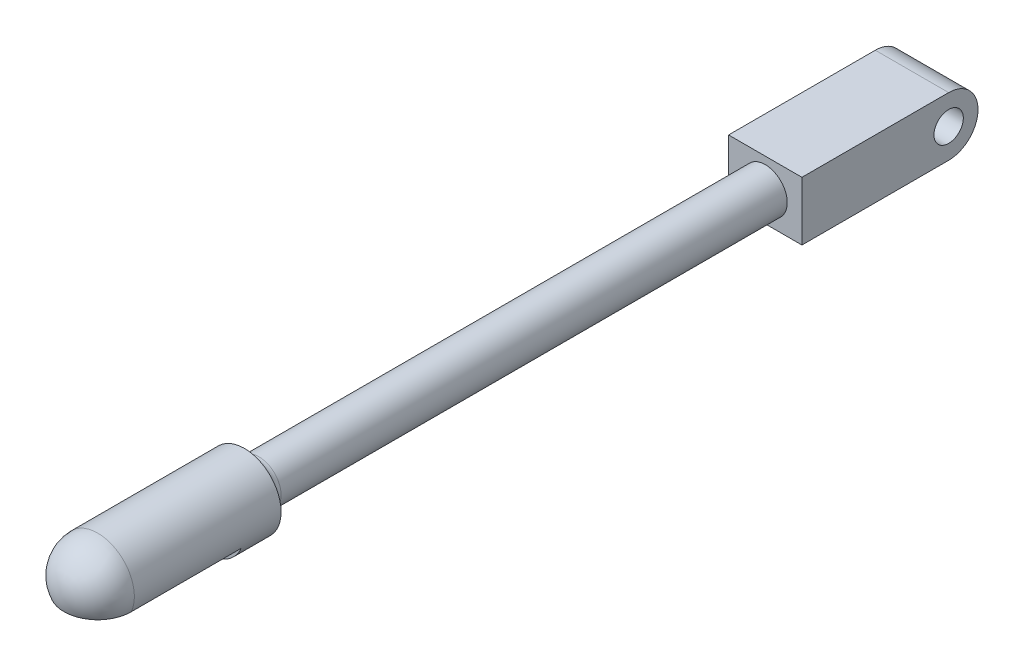
ISO-10303-21;
HEADER;
FILE_DESCRIPTION(('STEP AP214'),'2;1');
FILE_NAME('part.step','',(''),(''),'','','');
FILE_SCHEMA(('AUTOMOTIVE_DESIGN { 1 0 10303 214 1 1 1 1 }'));
ENDSEC;
DATA;
#1=APPLICATION_CONTEXT('core data for automotive mechanical design processes');
#2=APPLICATION_PROTOCOL_DEFINITION('international standard','automotive_design',2000,#1);
#3=PRODUCT_CONTEXT('',#1,'mechanical');
#4=PRODUCT('Part','Part','',(#3));
#5=PRODUCT_RELATED_PRODUCT_CATEGORY('part','',(#4));
#6=PRODUCT_DEFINITION_FORMATION('','',#4);
#7=PRODUCT_DEFINITION_CONTEXT('part definition',#1,'design');
#8=PRODUCT_DEFINITION('design','',#6,#7);
#9=PRODUCT_DEFINITION_SHAPE('','',#8);
#10=(LENGTH_UNIT() NAMED_UNIT(*) SI_UNIT(.MILLI.,.METRE.));
#11=(NAMED_UNIT(*) PLANE_ANGLE_UNIT() SI_UNIT($,.RADIAN.));
#12=(NAMED_UNIT(*) SI_UNIT($,.STERADIAN.) SOLID_ANGLE_UNIT());
#13=UNCERTAINTY_MEASURE_WITH_UNIT(LENGTH_MEASURE(1.E-05),#10,'distance_accuracy_value','');
#14=(GEOMETRIC_REPRESENTATION_CONTEXT(3) GLOBAL_UNCERTAINTY_ASSIGNED_CONTEXT((#13)) GLOBAL_UNIT_ASSIGNED_CONTEXT((#10,
#11,#12)) REPRESENTATION_CONTEXT('',''));
#15=CARTESIAN_POINT('',(0.,0.,0.));
#16=DIRECTION('',(0.,0.,1.));
#17=DIRECTION('',(1.,0.,0.));
#18=AXIS2_PLACEMENT_3D('',#15,#16,#17);
#19=CARTESIAN_POINT('',(0.,0.,27.705));
#20=DIRECTION('',(0.,0.,-1.));
#21=DIRECTION('',(-1.,0.,0.));
#22=AXIS2_PLACEMENT_3D('',#19,#20,#21);
#23=CYLINDRICAL_SURFACE('',#22,2.5);
#24=CARTESIAN_POINT('',(0.,0.,17.705));
#25=DIRECTION('',(0.,0.,1.));
#26=DIRECTION('',(1.,0.,0.));
#27=AXIS2_PLACEMENT_3D('',#24,#25,#26);
#28=CIRCLE('',#27,2.5);
#29=CARTESIAN_POINT('',(2.5,0.,17.705));
#30=VERTEX_POINT('',#29);
#31=EDGE_CURVE('E126',#30,#30,#28,.T.);
#32=ORIENTED_EDGE('',*,*,#31,.T.);
#33=EDGE_LOOP('',(#32));
#34=FACE_BOUND('',#33,.T.);
#35=DIRECTION('',(0.,0.,-1.));
#36=VECTOR('',#35,1.);
#37=CARTESIAN_POINT('',(-2.29128784747792,-1.,27.705));
#38=LINE('',#37,#36);
#39=CARTESIAN_POINT('',(-2.29128784747792,-1.,27.705));
#40=VERTEX_POINT('',#39);
#41=CARTESIAN_POINT('',(-2.29128784747792,-1.,20.205));
#42=VERTEX_POINT('',#41);
#43=EDGE_CURVE('E124',#40,#42,#38,.T.);
#44=ORIENTED_EDGE('',*,*,#43,.F.);
#45=CARTESIAN_POINT('',(0.,0.,27.705));
#46=DIRECTION('',(0.,0.,1.));
#47=DIRECTION('',(1.,0.,0.));
#48=AXIS2_PLACEMENT_3D('',#45,#46,#47);
#49=CIRCLE('',#48,2.5);
#50=CARTESIAN_POINT('',(2.29128784747792,-1.,27.705));
#51=VERTEX_POINT('',#50);
#52=EDGE_CURVE('E127',#51,#40,#49,.T.);
#53=ORIENTED_EDGE('',*,*,#52,.F.);
#54=DIRECTION('',(0.,0.,-1.));
#55=VECTOR('',#54,1.);
#56=CARTESIAN_POINT('',(2.29128784747792,-1.,27.705));
#57=LINE('',#56,#55);
#58=CARTESIAN_POINT('',(2.29128784747792,-1.,20.205));
#59=VERTEX_POINT('',#58);
#60=EDGE_CURVE('E53',#59,#51,#57,.F.);
#61=ORIENTED_EDGE('',*,*,#60,.F.);
#62=CARTESIAN_POINT('',(0.,0.,20.205));
#63=DIRECTION('',(0.,0.,1.));
#64=DIRECTION('',(1.,0.,0.));
#65=AXIS2_PLACEMENT_3D('',#62,#63,#64);
#66=CIRCLE('',#65,2.5);
#67=EDGE_CURVE('E11',#42,#59,#66,.T.);
#68=ORIENTED_EDGE('',*,*,#67,.F.);
#69=EDGE_LOOP('',(#44,#53,#61,#68));
#70=FACE_BOUND('',#69,.T.);
#71=ADVANCED_FACE('F37',(#34,#70),#23,.T.);
#72=CARTESIAN_POINT('',(0.,0.,27.705));
#73=DIRECTION('',(0.,0.,-1.));
#74=DIRECTION('',(0.,1.,0.));
#75=AXIS2_PLACEMENT_3D('',#72,#73,#74);
#76=SPHERICAL_SURFACE('',#75,2.5);
#77=ORIENTED_EDGE('',*,*,#52,.T.);
#78=CARTESIAN_POINT('',(0.,-1.,27.705));
#79=DIRECTION('',(0.,-1.,0.));
#80=DIRECTION('',(0.,0.,-1.));
#81=AXIS2_PLACEMENT_3D('',#78,#79,#80);
#82=CIRCLE('',#81,2.29128784747792);
#83=EDGE_CURVE('E46',#40,#51,#82,.F.);
#84=ORIENTED_EDGE('',*,*,#83,.T.);
#85=EDGE_LOOP('',(#77,#84));
#86=FACE_BOUND('',#85,.T.);
#87=ADVANCED_FACE('F137',(#86),#76,.T.);
#88=CARTESIAN_POINT('',(0.,0.,17.705));
#89=DIRECTION('',(0.,0.,-1.));
#90=DIRECTION('',(-1.,0.,0.));
#91=AXIS2_PLACEMENT_3D('',#88,#89,#90);
#92=CYLINDRICAL_SURFACE('',#91,1.5);
#93=CARTESIAN_POINT('',(0.,0.,16.705));
#94=DIRECTION('',(0.,0.,1.));
#95=DIRECTION('',(1.,0.,0.));
#96=AXIS2_PLACEMENT_3D('',#93,#94,#95);
#97=CIRCLE('',#96,1.5);
#98=CARTESIAN_POINT('',(1.5,0.,16.705));
#99=VERTEX_POINT('',#98);
#100=EDGE_CURVE('E130',#99,#99,#97,.F.);
#101=ORIENTED_EDGE('',*,*,#100,.T.);
#102=EDGE_LOOP('',(#101));
#103=FACE_BOUND('',#102,.T.);
#104=CARTESIAN_POINT('',(0.,0.,-17.795));
#105=DIRECTION('',(0.,0.,-1.));
#106=DIRECTION('',(-1.,0.,0.));
#107=AXIS2_PLACEMENT_3D('',#104,#105,#106);
#108=CIRCLE('',#107,1.5);
#109=CARTESIAN_POINT('',(-1.5,0.,-17.795));
#110=VERTEX_POINT('',#109);
#111=EDGE_CURVE('E113',#110,#110,#108,.T.);
#112=ORIENTED_EDGE('',*,*,#111,.F.);
#113=EDGE_LOOP('',(#112));
#114=FACE_BOUND('',#113,.T.);
#115=ADVANCED_FACE('F153',(#103,#114),#92,.T.);
#116=CARTESIAN_POINT('',(0.,0.,16.705));
#117=DIRECTION('',(0.,0.,1.));
#118=DIRECTION('',(1.,0.,0.));
#119=AXIS2_PLACEMENT_3D('',#116,#117,#118);
#120=TOROIDAL_SURFACE('',#119,2.5,1.);
#121=ORIENTED_EDGE('',*,*,#100,.F.);
#122=EDGE_LOOP('',(#121));
#123=FACE_BOUND('',#122,.T.);
#124=ORIENTED_EDGE('',*,*,#31,.F.);
#125=EDGE_LOOP('',(#124));
#126=FACE_BOUND('',#125,.T.);
#127=ADVANCED_FACE('F39',(#123,#126),#120,.F.);
#128=CARTESIAN_POINT('',(0.,0.,20.205));
#129=DIRECTION('',(0.,0.,1.));
#130=DIRECTION('',(1.,0.,0.));
#131=AXIS2_PLACEMENT_3D('',#128,#129,#130);
#132=PLANE('',#131);
#133=ORIENTED_EDGE('',*,*,#67,.T.);
#134=DIRECTION('',(1.,0.,0.));
#135=VECTOR('',#134,1.);
#136=CARTESIAN_POINT('',(0.,-1.,20.205));
#137=LINE('',#136,#135);
#138=EDGE_CURVE('E121',#42,#59,#137,.T.);
#139=ORIENTED_EDGE('',*,*,#138,.F.);
#140=EDGE_LOOP('',(#133,#139));
#141=FACE_BOUND('',#140,.T.);
#142=ADVANCED_FACE('F143',(#141),#132,.T.);
#143=CARTESIAN_POINT('',(0.,-1.,20.205));
#144=DIRECTION('',(0.,-1.,0.));
#145=DIRECTION('',(0.,0.,-1.));
#146=AXIS2_PLACEMENT_3D('',#143,#144,#145);
#147=PLANE('',#146);
#148=CARTESIAN_POINT('',(0.,-1.,27.705));
#149=DIRECTION('',(0.,-1.,0.));
#150=DIRECTION('',(0.,0.,-1.));
#151=AXIS2_PLACEMENT_3D('',#148,#149,#150);
#152=CIRCLE('',#151,1.05689403442351);
#153=CARTESIAN_POINT('',(0.,-1.,26.6481059655765));
#154=VERTEX_POINT('',#153);
#155=EDGE_CURVE('E41',#154,#154,#152,.F.);
#156=ORIENTED_EDGE('',*,*,#155,.T.);
#157=EDGE_LOOP('',(#156));
#158=FACE_BOUND('',#157,.T.);
#159=ORIENTED_EDGE('',*,*,#43,.T.);
#160=ORIENTED_EDGE('',*,*,#138,.T.);
#161=ORIENTED_EDGE('',*,*,#60,.T.);
#162=ORIENTED_EDGE('',*,*,#83,.F.);
#163=EDGE_LOOP('',(#159,#160,#161,#162));
#164=FACE_BOUND('',#163,.T.);
#165=ADVANCED_FACE('F141',(#158,#164),#147,.T.);
#166=CARTESIAN_POINT('',(0.,0.,27.705));
#167=DIRECTION('',(0.,0.,-1.));
#168=DIRECTION('',(0.,-1.,0.));
#169=AXIS2_PLACEMENT_3D('',#166,#167,#168);
#170=SPHERICAL_SURFACE('',#169,1.455);
#171=CARTESIAN_POINT('',(0.,0.,27.705));
#172=DIRECTION('',(0.,-1.,0.));
#173=DIRECTION('',(0.,0.,-1.));
#174=AXIS2_PLACEMENT_3D('',#171,#172,#173);
#175=SPHERICAL_SURFACE('',#174,1.455);
#176=ORIENTED_EDGE('',*,*,#155,.F.);
#177=EDGE_LOOP('',(#176));
#178=FACE_BOUND('',#177,.T.);
#179=ADVANCED_FACE('F150',(#178),#175,.F.);
#180=CARTESIAN_POINT('',(2.5,-2.,0.));
#181=DIRECTION('',(0.,1.,0.));
#182=DIRECTION('',(0.,0.,1.));
#183=AXIS2_PLACEMENT_3D('',#180,#181,#182);
#184=PLANE('',#183);
#185=DIRECTION('',(0.,0.,-1.));
#186=VECTOR('',#185,1.);
#187=CARTESIAN_POINT('',(-2.5,-2.,0.));
#188=LINE('',#187,#186);
#189=CARTESIAN_POINT('',(-2.5,-2.,-17.795));
#190=VERTEX_POINT('',#189);
#191=CARTESIAN_POINT('',(-2.5,-2.,-27.795));
#192=VERTEX_POINT('',#191);
#193=EDGE_CURVE('E112',#190,#192,#188,.T.);
#194=ORIENTED_EDGE('',*,*,#193,.T.);
#195=DIRECTION('',(-1.,0.,0.));
#196=VECTOR('',#195,1.);
#197=CARTESIAN_POINT('',(2.5,-2.,-27.795));
#198=LINE('',#197,#196);
#199=CARTESIAN_POINT('',(2.5,-2.,-27.795));
#200=VERTEX_POINT('',#199);
#201=EDGE_CURVE('E92',#200,#192,#198,.T.);
#202=ORIENTED_EDGE('',*,*,#201,.F.);
#203=DIRECTION('',(0.,0.,-1.));
#204=VECTOR('',#203,1.);
#205=CARTESIAN_POINT('',(2.5,-2.,0.));
#206=LINE('',#205,#204);
#207=CARTESIAN_POINT('',(2.5,-2.,-17.795));
#208=VERTEX_POINT('',#207);
#209=EDGE_CURVE('E99',#208,#200,#206,.T.);
#210=ORIENTED_EDGE('',*,*,#209,.F.);
#211=DIRECTION('',(-1.,0.,0.));
#212=VECTOR('',#211,1.);
#213=CARTESIAN_POINT('',(2.5,-2.,-17.795));
#214=LINE('',#213,#212);
#215=EDGE_CURVE('E179',#208,#190,#214,.T.);
#216=ORIENTED_EDGE('',*,*,#215,.T.);
#217=EDGE_LOOP('',(#194,#202,#210,#216));
#218=FACE_BOUND('',#217,.T.);
#219=ADVANCED_FACE('F110',(#218),#184,.F.);
#220=CARTESIAN_POINT('',(2.5,0.,-27.795));
#221=DIRECTION('',(-1.,0.,0.));
#222=DIRECTION('',(0.,0.,1.));
#223=AXIS2_PLACEMENT_3D('',#220,#221,#222);
#224=CYLINDRICAL_SURFACE('',#223,2.);
#225=CARTESIAN_POINT('',(-2.5,0.,-27.795));
#226=DIRECTION('',(1.,0.,0.));
#227=DIRECTION('',(0.,0.,-1.));
#228=AXIS2_PLACEMENT_3D('',#225,#226,#227);
#229=CIRCLE('',#228,2.);
#230=CARTESIAN_POINT('',(-2.5,2.,-27.795));
#231=VERTEX_POINT('',#230);
#232=EDGE_CURVE('E187',#192,#231,#229,.T.);
#233=ORIENTED_EDGE('',*,*,#232,.T.);
#234=DIRECTION('',(-1.,0.,0.));
#235=VECTOR('',#234,1.);
#236=CARTESIAN_POINT('',(2.5,2.,-27.795));
#237=LINE('',#236,#235);
#238=CARTESIAN_POINT('',(2.5,2.,-27.795));
#239=VERTEX_POINT('',#238);
#240=EDGE_CURVE('E95',#239,#231,#237,.T.);
#241=ORIENTED_EDGE('',*,*,#240,.F.);
#242=CARTESIAN_POINT('',(2.5,0.,-27.795));
#243=DIRECTION('',(1.,0.,0.));
#244=DIRECTION('',(0.,0.,-1.));
#245=AXIS2_PLACEMENT_3D('',#242,#243,#244);
#246=CIRCLE('',#245,2.);
#247=EDGE_CURVE('E88',#200,#239,#246,.T.);
#248=ORIENTED_EDGE('',*,*,#247,.F.);
#249=ORIENTED_EDGE('',*,*,#201,.T.);
#250=EDGE_LOOP('',(#233,#241,#248,#249));
#251=FACE_BOUND('',#250,.T.);
#252=ADVANCED_FACE('F90',(#251),#224,.T.);
#253=CARTESIAN_POINT('',(2.5,2.,0.));
#254=DIRECTION('',(0.,-1.,0.));
#255=DIRECTION('',(0.,0.,-1.));
#256=AXIS2_PLACEMENT_3D('',#253,#254,#255);
#257=PLANE('',#256);
#258=DIRECTION('',(0.,0.,1.));
#259=VECTOR('',#258,1.);
#260=CARTESIAN_POINT('',(-2.5,2.,0.));
#261=LINE('',#260,#259);
#262=CARTESIAN_POINT('',(-2.5,2.,-17.795));
#263=VERTEX_POINT('',#262);
#264=EDGE_CURVE('E183',#231,#263,#261,.T.);
#265=ORIENTED_EDGE('',*,*,#264,.T.);
#266=DIRECTION('',(-1.,0.,0.));
#267=VECTOR('',#266,1.);
#268=CARTESIAN_POINT('',(2.5,2.,-17.795));
#269=LINE('',#268,#267);
#270=CARTESIAN_POINT('',(2.5,2.,-17.795));
#271=VERTEX_POINT('',#270);
#272=EDGE_CURVE('E117',#271,#263,#269,.T.);
#273=ORIENTED_EDGE('',*,*,#272,.F.);
#274=DIRECTION('',(0.,0.,1.));
#275=VECTOR('',#274,1.);
#276=CARTESIAN_POINT('',(2.5,2.,0.));
#277=LINE('',#276,#275);
#278=EDGE_CURVE('E98',#239,#271,#277,.T.);
#279=ORIENTED_EDGE('',*,*,#278,.F.);
#280=ORIENTED_EDGE('',*,*,#240,.T.);
#281=EDGE_LOOP('',(#265,#273,#279,#280));
#282=FACE_BOUND('',#281,.T.);
#283=ADVANCED_FACE('F196',(#282),#257,.F.);
#284=CARTESIAN_POINT('',(2.5,0.,-27.795));
#285=DIRECTION('',(-1.,0.,0.));
#286=DIRECTION('',(0.,0.,1.));
#287=AXIS2_PLACEMENT_3D('',#284,#285,#286);
#288=CYLINDRICAL_SURFACE('',#287,1.);
#289=CARTESIAN_POINT('',(2.5,0.,-27.795));
#290=DIRECTION('',(1.,0.,0.));
#291=DIRECTION('',(0.,0.,-1.));
#292=AXIS2_PLACEMENT_3D('',#289,#290,#291);
#293=CIRCLE('',#292,1.);
#294=CARTESIAN_POINT('',(2.5,0.,-28.795));
#295=VERTEX_POINT('',#294);
#296=EDGE_CURVE('E108',#295,#295,#293,.T.);
#297=ORIENTED_EDGE('',*,*,#296,.T.);
#298=EDGE_LOOP('',(#297));
#299=FACE_BOUND('',#298,.T.);
#300=CARTESIAN_POINT('',(-2.5,0.,-27.795));
#301=DIRECTION('',(1.,0.,0.));
#302=DIRECTION('',(0.,0.,-1.));
#303=AXIS2_PLACEMENT_3D('',#300,#301,#302);
#304=CIRCLE('',#303,1.);
#305=CARTESIAN_POINT('',(-2.5,0.,-28.795));
#306=VERTEX_POINT('',#305);
#307=EDGE_CURVE('E188',#306,#306,#304,.T.);
#308=ORIENTED_EDGE('',*,*,#307,.F.);
#309=EDGE_LOOP('',(#308));
#310=FACE_BOUND('',#309,.T.);
#311=ADVANCED_FACE('F174',(#299,#310),#288,.F.);
#312=CARTESIAN_POINT('',(2.5,0.,-17.795));
#313=DIRECTION('',(0.,0.,-1.));
#314=DIRECTION('',(-1.,0.,0.));
#315=AXIS2_PLACEMENT_3D('',#312,#313,#314);
#316=PLANE('',#315);
#317=ORIENTED_EDGE('',*,*,#111,.T.);
#318=EDGE_LOOP('',(#317));
#319=FACE_BOUND('',#318,.T.);
#320=DIRECTION('',(0.,-1.,0.));
#321=VECTOR('',#320,1.);
#322=CARTESIAN_POINT('',(-2.5,0.,-17.795));
#323=LINE('',#322,#321);
#324=EDGE_CURVE('E178',#263,#190,#323,.T.);
#325=ORIENTED_EDGE('',*,*,#324,.T.);
#326=ORIENTED_EDGE('',*,*,#215,.F.);
#327=DIRECTION('',(0.,-1.,0.));
#328=VECTOR('',#327,1.);
#329=CARTESIAN_POINT('',(2.5,0.,-17.795));
#330=LINE('',#329,#328);
#331=EDGE_CURVE('E104',#271,#208,#330,.T.);
#332=ORIENTED_EDGE('',*,*,#331,.F.);
#333=ORIENTED_EDGE('',*,*,#272,.T.);
#334=EDGE_LOOP('',(#325,#326,#332,#333));
#335=FACE_BOUND('',#334,.T.);
#336=ADVANCED_FACE('F171',(#319,#335),#316,.F.);
#337=CARTESIAN_POINT('',(2.5,0.,0.));
#338=DIRECTION('',(1.,0.,0.));
#339=DIRECTION('',(0.,0.,-1.));
#340=AXIS2_PLACEMENT_3D('',#337,#338,#339);
#341=PLANE('',#340);
#342=ORIENTED_EDGE('',*,*,#296,.F.);
#343=EDGE_LOOP('',(#342));
#344=FACE_BOUND('',#343,.T.);
#345=ORIENTED_EDGE('',*,*,#209,.T.);
#346=ORIENTED_EDGE('',*,*,#247,.T.);
#347=ORIENTED_EDGE('',*,*,#278,.T.);
#348=ORIENTED_EDGE('',*,*,#331,.T.);
#349=EDGE_LOOP('',(#345,#346,#347,#348));
#350=FACE_BOUND('',#349,.T.);
#351=ADVANCED_FACE('F102',(#344,#350),#341,.T.);
#352=CARTESIAN_POINT('',(-2.5,0.,0.));
#353=DIRECTION('',(1.,0.,0.));
#354=DIRECTION('',(0.,0.,-1.));
#355=AXIS2_PLACEMENT_3D('',#352,#353,#354);
#356=PLANE('',#355);
#357=ORIENTED_EDGE('',*,*,#307,.T.);
#358=EDGE_LOOP('',(#357));
#359=FACE_BOUND('',#358,.T.);
#360=ORIENTED_EDGE('',*,*,#193,.F.);
#361=ORIENTED_EDGE('',*,*,#324,.F.);
#362=ORIENTED_EDGE('',*,*,#264,.F.);
#363=ORIENTED_EDGE('',*,*,#232,.F.);
#364=EDGE_LOOP('',(#360,#361,#362,#363));
#365=FACE_BOUND('',#364,.T.);
#366=ADVANCED_FACE('F186',(#359,#365),#356,.F.);
#367=CLOSED_SHELL('',(#71,#87,#115,#127,#142,#165,#179,#219,#252,#283,#311,#336,#351,#366));
#368=MANIFOLD_SOLID_BREP('B2',#367);
#369=ADVANCED_BREP_SHAPE_REPRESENTATION('',(#18,#368),#14);
#370=SHAPE_DEFINITION_REPRESENTATION(#9,#369);
ENDSEC;
END-ISO-10303-21;
